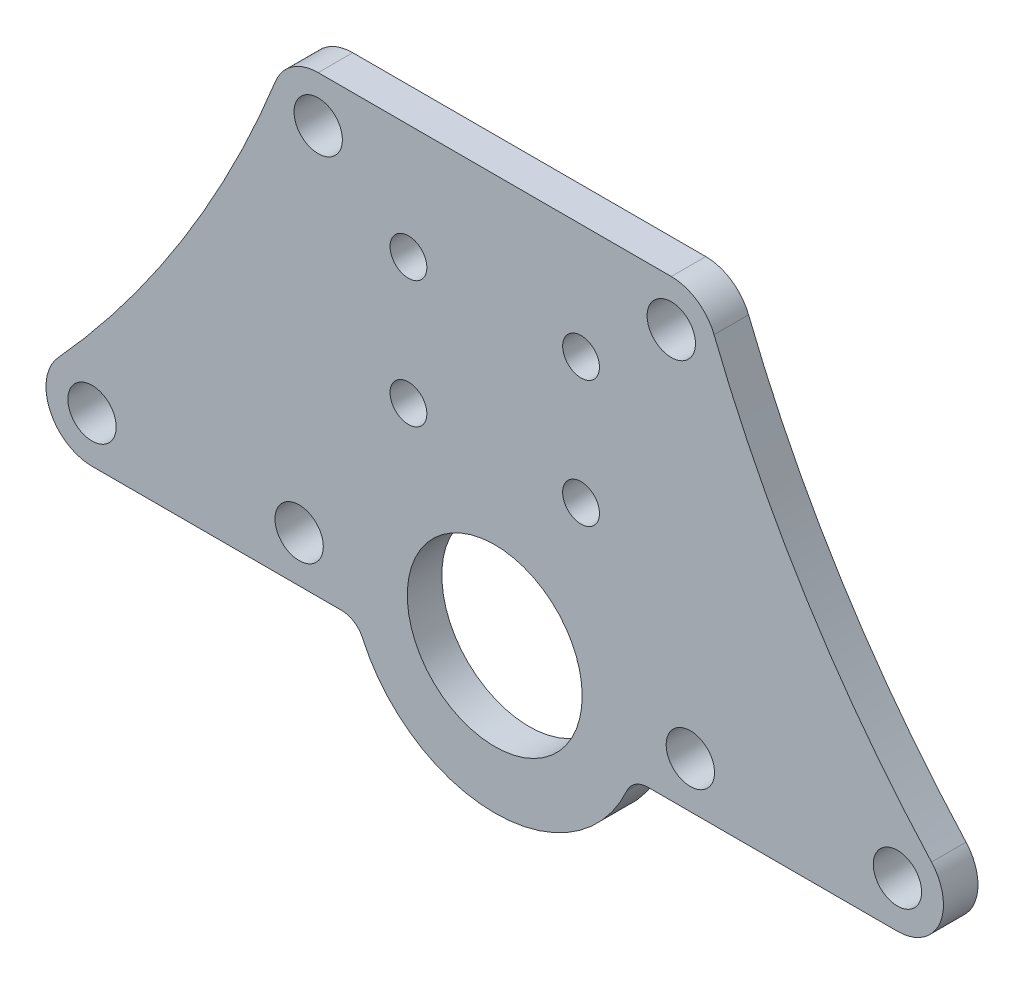
ISO-10303-21;
HEADER;
FILE_DESCRIPTION(('STEP AP214'),'2;1');
FILE_NAME('part.step','',(''),(''),'','','');
FILE_SCHEMA(('AUTOMOTIVE_DESIGN { 1 0 10303 214 1 1 1 1 }'));
ENDSEC;
DATA;
#1=APPLICATION_CONTEXT('core data for automotive mechanical design processes');
#2=APPLICATION_PROTOCOL_DEFINITION('international standard','automotive_design',2000,#1);
#3=PRODUCT_CONTEXT('',#1,'mechanical');
#4=PRODUCT('Part','Part','',(#3));
#5=PRODUCT_RELATED_PRODUCT_CATEGORY('part','',(#4));
#6=PRODUCT_DEFINITION_FORMATION('','',#4);
#7=PRODUCT_DEFINITION_CONTEXT('part definition',#1,'design');
#8=PRODUCT_DEFINITION('design','',#6,#7);
#9=PRODUCT_DEFINITION_SHAPE('','',#8);
#10=(LENGTH_UNIT() NAMED_UNIT(*) SI_UNIT(.MILLI.,.METRE.));
#11=(NAMED_UNIT(*) PLANE_ANGLE_UNIT() SI_UNIT($,.RADIAN.));
#12=(NAMED_UNIT(*) SI_UNIT($,.STERADIAN.) SOLID_ANGLE_UNIT());
#13=UNCERTAINTY_MEASURE_WITH_UNIT(LENGTH_MEASURE(1.E-05),#10,'distance_accuracy_value','');
#14=(GEOMETRIC_REPRESENTATION_CONTEXT(3) GLOBAL_UNCERTAINTY_ASSIGNED_CONTEXT((#13)) GLOBAL_UNIT_ASSIGNED_CONTEXT((#10,
#11,#12)) REPRESENTATION_CONTEXT('',''));
#15=CARTESIAN_POINT('',(0.,0.,0.));
#16=DIRECTION('',(0.,0.,1.));
#17=DIRECTION('',(1.,0.,0.));
#18=AXIS2_PLACEMENT_3D('',#15,#16,#17);
#19=CARTESIAN_POINT('',(0.,-20.,3.));
#20=DIRECTION('',(0.,0.,-1.));
#21=DIRECTION('',(-1.,0.,0.));
#22=AXIS2_PLACEMENT_3D('',#19,#20,#21);
#23=CYLINDRICAL_SURFACE('',#22,12.6);
#24=CARTESIAN_POINT('',(0.,-20.,0.));
#25=DIRECTION('',(0.,0.,1.));
#26=DIRECTION('',(1.,0.,0.));
#27=AXIS2_PLACEMENT_3D('',#24,#25,#26);
#28=CIRCLE('',#27,12.6);
#29=CARTESIAN_POINT('',(-11.4868387650895,-25.1780821917808,0.));
#30=VERTEX_POINT('',#29);
#31=CARTESIAN_POINT('',(11.4868387650895,-25.1780821917808,0.));
#32=VERTEX_POINT('',#31);
#33=EDGE_CURVE('E208',#30,#32,#28,.T.);
#34=ORIENTED_EDGE('',*,*,#33,.T.);
#35=DIRECTION('',(0.,0.,-1.));
#36=VECTOR('',#35,1.);
#37=CARTESIAN_POINT('',(11.4868387650895,-25.1780821917808,3.));
#38=LINE('',#37,#36);
#39=CARTESIAN_POINT('',(11.4868387650895,-25.1780821917808,3.));
#40=VERTEX_POINT('',#39);
#41=EDGE_CURVE('E283',#32,#40,#38,.F.);
#42=ORIENTED_EDGE('',*,*,#41,.T.);
#43=CARTESIAN_POINT('',(0.,-20.,3.));
#44=DIRECTION('',(0.,0.,1.));
#45=DIRECTION('',(1.,0.,0.));
#46=AXIS2_PLACEMENT_3D('',#43,#44,#45);
#47=CIRCLE('',#46,12.6);
#48=CARTESIAN_POINT('',(-11.4868387650895,-25.1780821917808,3.));
#49=VERTEX_POINT('',#48);
#50=EDGE_CURVE('E139',#49,#40,#47,.T.);
#51=ORIENTED_EDGE('',*,*,#50,.F.);
#52=DIRECTION('',(0.,0.,-1.));
#53=VECTOR('',#52,1.);
#54=CARTESIAN_POINT('',(-11.4868387650895,-25.1780821917808,3.));
#55=LINE('',#54,#53);
#56=EDGE_CURVE('E280',#49,#30,#55,.T.);
#57=ORIENTED_EDGE('',*,*,#56,.T.);
#58=EDGE_LOOP('',(#34,#42,#51,#57));
#59=FACE_BOUND('',#58,.T.);
#60=ADVANCED_FACE('F37',(#59),#23,.T.);
#61=CARTESIAN_POINT('',(0.,-24.,3.));
#62=DIRECTION('',(0.,1.,0.));
#63=DIRECTION('',(-1.,0.,0.));
#64=AXIS2_PLACEMENT_3D('',#61,#62,#63);
#65=PLANE('',#64);
#66=DIRECTION('',(1.,0.,0.));
#67=VECTOR('',#66,1.);
#68=CARTESIAN_POINT('',(0.,-24.,3.));
#69=LINE('',#68,#67);
#70=CARTESIAN_POINT('',(13.3101465055799,-24.,3.));
#71=VERTEX_POINT('',#70);
#72=CARTESIAN_POINT('',(35.,-24.,3.));
#73=VERTEX_POINT('',#72);
#74=EDGE_CURVE('E125',#71,#73,#69,.T.);
#75=ORIENTED_EDGE('',*,*,#74,.F.);
#76=DIRECTION('',(0.,0.,1.));
#77=VECTOR('',#76,1.);
#78=CARTESIAN_POINT('',(13.3101465055799,-24.,0.));
#79=LINE('',#78,#77);
#80=CARTESIAN_POINT('',(13.3101465055799,-24.,0.));
#81=VERTEX_POINT('',#80);
#82=EDGE_CURVE('E149',#71,#81,#79,.F.);
#83=ORIENTED_EDGE('',*,*,#82,.T.);
#84=DIRECTION('',(1.,0.,0.));
#85=VECTOR('',#84,1.);
#86=CARTESIAN_POINT('',(0.,-24.,0.));
#87=LINE('',#86,#85);
#88=CARTESIAN_POINT('',(35.,-24.,0.));
#89=VERTEX_POINT('',#88);
#90=EDGE_CURVE('E145',#81,#89,#87,.T.);
#91=ORIENTED_EDGE('',*,*,#90,.T.);
#92=DIRECTION('',(0.,0.,-1.));
#93=VECTOR('',#92,1.);
#94=CARTESIAN_POINT('',(35.,-24.,3.));
#95=LINE('',#94,#93);
#96=EDGE_CURVE('E142',#73,#89,#95,.T.);
#97=ORIENTED_EDGE('',*,*,#96,.F.);
#98=EDGE_LOOP('',(#75,#83,#91,#97));
#99=FACE_BOUND('',#98,.T.);
#100=ADVANCED_FACE('F143',(#99),#65,.F.);
#101=CARTESIAN_POINT('',(35.,-20.,3.));
#102=DIRECTION('',(0.,0.,-1.));
#103=DIRECTION('',(-1.,0.,0.));
#104=AXIS2_PLACEMENT_3D('',#101,#102,#103);
#105=CYLINDRICAL_SURFACE('',#104,4.00000000000002);
#106=CARTESIAN_POINT('',(35.,-20.,0.));
#107=DIRECTION('',(0.,0.,1.));
#108=DIRECTION('',(1.,0.,0.));
#109=AXIS2_PLACEMENT_3D('',#106,#107,#108);
#110=CIRCLE('',#109,4.00000000000002);
#111=CARTESIAN_POINT('',(37.9597935701072,-17.3093454286453,0.));
#112=VERTEX_POINT('',#111);
#113=EDGE_CURVE('E212',#89,#112,#110,.T.);
#114=ORIENTED_EDGE('',*,*,#113,.T.);
#115=DIRECTION('',(0.,0.,-1.));
#116=VECTOR('',#115,1.);
#117=CARTESIAN_POINT('',(37.9597935701072,-17.3093454286453,3.));
#118=LINE('',#117,#116);
#119=CARTESIAN_POINT('',(37.9597935701072,-17.3093454286453,3.));
#120=VERTEX_POINT('',#119);
#121=EDGE_CURVE('E150',#120,#112,#118,.T.);
#122=ORIENTED_EDGE('',*,*,#121,.F.);
#123=CARTESIAN_POINT('',(35.,-20.,3.));
#124=DIRECTION('',(0.,0.,1.));
#125=DIRECTION('',(1.,0.,0.));
#126=AXIS2_PLACEMENT_3D('',#123,#124,#125);
#127=CIRCLE('',#126,4.00000000000002);
#128=EDGE_CURVE('E131',#73,#120,#127,.T.);
#129=ORIENTED_EDGE('',*,*,#128,.F.);
#130=ORIENTED_EDGE('',*,*,#96,.T.);
#131=EDGE_LOOP('',(#114,#122,#129,#130));
#132=FACE_BOUND('',#131,.T.);
#133=ADVANCED_FACE('F152',(#132),#105,.T.);
#134=CARTESIAN_POINT('',(111.954632822788,49.9570188552223,3.));
#135=DIRECTION('',(0.,0.,-1.));
#136=DIRECTION('',(-1.,0.,0.));
#137=AXIS2_PLACEMENT_3D('',#134,#135,#136);
#138=CYLINDRICAL_SURFACE('',#137,100.);
#139=CARTESIAN_POINT('',(111.954632822788,49.9570188552223,0.));
#140=DIRECTION('',(0.,0.,1.));
#141=DIRECTION('',(1.,0.,0.));
#142=AXIS2_PLACEMENT_3D('',#139,#140,#141);
#143=CIRCLE('',#142,100.);
#144=CARTESIAN_POINT('',(19.0588225485857,12.9385311294998,0.));
#145=VERTEX_POINT('',#144);
#146=EDGE_CURVE('E214',#145,#112,#143,.T.);
#147=ORIENTED_EDGE('',*,*,#146,.F.);
#148=DIRECTION('',(0.,0.,-1.));
#149=VECTOR('',#148,1.);
#150=CARTESIAN_POINT('',(19.0588225485857,12.9385311294998,3.));
#151=LINE('',#150,#149);
#152=CARTESIAN_POINT('',(19.0588225485857,12.9385311294998,3.));
#153=VERTEX_POINT('',#152);
#154=EDGE_CURVE('E276',#153,#145,#151,.T.);
#155=ORIENTED_EDGE('',*,*,#154,.F.);
#156=CARTESIAN_POINT('',(111.954632822788,49.9570188552223,3.));
#157=DIRECTION('',(0.,0.,1.));
#158=DIRECTION('',(1.,0.,0.));
#159=AXIS2_PLACEMENT_3D('',#156,#157,#158);
#160=CIRCLE('',#159,100.);
#161=EDGE_CURVE('E154',#153,#120,#160,.T.);
#162=ORIENTED_EDGE('',*,*,#161,.T.);
#163=ORIENTED_EDGE('',*,*,#121,.T.);
#164=EDGE_LOOP('',(#147,#155,#162,#163));
#165=FACE_BOUND('',#164,.T.);
#166=ADVANCED_FACE('F312',(#165),#138,.F.);
#167=CARTESIAN_POINT('',(15.3429901376176,11.4577916204709,3.));
#168=DIRECTION('',(0.,0.,-1.));
#169=DIRECTION('',(-1.,0.,0.));
#170=AXIS2_PLACEMENT_3D('',#167,#168,#169);
#171=CYLINDRICAL_SURFACE('',#170,4.00000000000002);
#172=CARTESIAN_POINT('',(15.3429901376176,11.4577916204709,0.));
#173=DIRECTION('',(0.,0.,1.));
#174=DIRECTION('',(1.,0.,0.));
#175=AXIS2_PLACEMENT_3D('',#172,#173,#174);
#176=CIRCLE('',#175,4.00000000000002);
#177=CARTESIAN_POINT('',(15.3429901376176,15.4577916204709,0.));
#178=VERTEX_POINT('',#177);
#179=EDGE_CURVE('E217',#145,#178,#176,.T.);
#180=ORIENTED_EDGE('',*,*,#179,.T.);
#181=DIRECTION('',(0.,0.,-1.));
#182=VECTOR('',#181,1.);
#183=CARTESIAN_POINT('',(15.3429901376176,15.4577916204709,3.));
#184=LINE('',#183,#182);
#185=CARTESIAN_POINT('',(15.3429901376176,15.4577916204709,3.));
#186=VERTEX_POINT('',#185);
#187=EDGE_CURVE('E274',#186,#178,#184,.T.);
#188=ORIENTED_EDGE('',*,*,#187,.F.);
#189=CARTESIAN_POINT('',(15.3429901376176,11.4577916204709,3.));
#190=DIRECTION('',(0.,0.,1.));
#191=DIRECTION('',(1.,0.,0.));
#192=AXIS2_PLACEMENT_3D('',#189,#190,#191);
#193=CIRCLE('',#192,4.00000000000002);
#194=EDGE_CURVE('E156',#153,#186,#193,.T.);
#195=ORIENTED_EDGE('',*,*,#194,.F.);
#196=ORIENTED_EDGE('',*,*,#154,.T.);
#197=EDGE_LOOP('',(#180,#188,#195,#196));
#198=FACE_BOUND('',#197,.T.);
#199=ADVANCED_FACE('F315',(#198),#171,.T.);
#200=CARTESIAN_POINT('',(0.,15.4577916204709,3.));
#201=DIRECTION('',(0.,1.,0.));
#202=DIRECTION('',(0.,0.,1.));
#203=AXIS2_PLACEMENT_3D('',#200,#201,#202);
#204=PLANE('',#203);
#205=DIRECTION('',(1.,0.,0.));
#206=VECTOR('',#205,1.);
#207=CARTESIAN_POINT('',(0.,15.4577916204709,0.));
#208=LINE('',#207,#206);
#209=CARTESIAN_POINT('',(-15.3429901376176,15.4577916204709,0.));
#210=VERTEX_POINT('',#209);
#211=EDGE_CURVE('E220',#210,#178,#208,.T.);
#212=ORIENTED_EDGE('',*,*,#211,.F.);
#213=DIRECTION('',(0.,0.,-1.));
#214=VECTOR('',#213,1.);
#215=CARTESIAN_POINT('',(-15.3429901376176,15.4577916204709,3.));
#216=LINE('',#215,#214);
#217=CARTESIAN_POINT('',(-15.3429901376176,15.4577916204709,3.));
#218=VERTEX_POINT('',#217);
#219=EDGE_CURVE('E272',#218,#210,#216,.T.);
#220=ORIENTED_EDGE('',*,*,#219,.F.);
#221=DIRECTION('',(1.,0.,0.));
#222=VECTOR('',#221,1.);
#223=CARTESIAN_POINT('',(0.,15.4577916204709,3.));
#224=LINE('',#223,#222);
#225=EDGE_CURVE('E161',#218,#186,#224,.T.);
#226=ORIENTED_EDGE('',*,*,#225,.T.);
#227=ORIENTED_EDGE('',*,*,#187,.T.);
#228=EDGE_LOOP('',(#212,#220,#226,#227));
#229=FACE_BOUND('',#228,.T.);
#230=ADVANCED_FACE('F319',(#229),#204,.T.);
#231=CARTESIAN_POINT('',(-15.3429901376176,11.4577916204709,3.));
#232=DIRECTION('',(0.,0.,-1.));
#233=DIRECTION('',(-1.,0.,0.));
#234=AXIS2_PLACEMENT_3D('',#231,#232,#233);
#235=CYLINDRICAL_SURFACE('',#234,4.00000000000002);
#236=CARTESIAN_POINT('',(-15.3429901376176,11.4577916204709,0.));
#237=DIRECTION('',(0.,0.,1.));
#238=DIRECTION('',(1.,0.,0.));
#239=AXIS2_PLACEMENT_3D('',#236,#237,#238);
#240=CIRCLE('',#239,4.00000000000002);
#241=CARTESIAN_POINT('',(-19.0588225485857,12.9385311294998,0.));
#242=VERTEX_POINT('',#241);
#243=EDGE_CURVE('E223',#242,#210,#240,.F.);
#244=ORIENTED_EDGE('',*,*,#243,.F.);
#245=DIRECTION('',(0.,0.,-1.));
#246=VECTOR('',#245,1.);
#247=CARTESIAN_POINT('',(-19.0588225485857,12.9385311294998,3.));
#248=LINE('',#247,#246);
#249=CARTESIAN_POINT('',(-19.0588225485857,12.9385311294998,3.));
#250=VERTEX_POINT('',#249);
#251=EDGE_CURVE('E270',#250,#242,#248,.T.);
#252=ORIENTED_EDGE('',*,*,#251,.F.);
#253=CARTESIAN_POINT('',(-15.3429901376176,11.4577916204709,3.));
#254=DIRECTION('',(0.,0.,1.));
#255=DIRECTION('',(1.,0.,0.));
#256=AXIS2_PLACEMENT_3D('',#253,#254,#255);
#257=CIRCLE('',#256,4.00000000000002);
#258=EDGE_CURVE('E164',#250,#218,#257,.F.);
#259=ORIENTED_EDGE('',*,*,#258,.T.);
#260=ORIENTED_EDGE('',*,*,#219,.T.);
#261=EDGE_LOOP('',(#244,#252,#259,#260));
#262=FACE_BOUND('',#261,.T.);
#263=ADVANCED_FACE('F323',(#262),#235,.T.);
#264=CARTESIAN_POINT('',(-111.954632822788,49.9570188552223,3.));
#265=DIRECTION('',(0.,0.,-1.));
#266=DIRECTION('',(-1.,0.,0.));
#267=AXIS2_PLACEMENT_3D('',#264,#265,#266);
#268=CYLINDRICAL_SURFACE('',#267,100.);
#269=CARTESIAN_POINT('',(-111.954632822788,49.9570188552223,0.));
#270=DIRECTION('',(0.,0.,1.));
#271=DIRECTION('',(1.,0.,0.));
#272=AXIS2_PLACEMENT_3D('',#269,#270,#271);
#273=CIRCLE('',#272,100.);
#274=CARTESIAN_POINT('',(-37.9597935701072,-17.3093454286453,0.));
#275=VERTEX_POINT('',#274);
#276=EDGE_CURVE('E226',#242,#275,#273,.F.);
#277=ORIENTED_EDGE('',*,*,#276,.T.);
#278=DIRECTION('',(0.,0.,-1.));
#279=VECTOR('',#278,1.);
#280=CARTESIAN_POINT('',(-37.9597935701072,-17.3093454286453,3.));
#281=LINE('',#280,#279);
#282=CARTESIAN_POINT('',(-37.9597935701072,-17.3093454286453,3.));
#283=VERTEX_POINT('',#282);
#284=EDGE_CURVE('E268',#283,#275,#281,.T.);
#285=ORIENTED_EDGE('',*,*,#284,.F.);
#286=CARTESIAN_POINT('',(-111.954632822788,49.9570188552223,3.));
#287=DIRECTION('',(0.,0.,1.));
#288=DIRECTION('',(1.,0.,0.));
#289=AXIS2_PLACEMENT_3D('',#286,#287,#288);
#290=CIRCLE('',#289,100.);
#291=EDGE_CURVE('E167',#250,#283,#290,.F.);
#292=ORIENTED_EDGE('',*,*,#291,.F.);
#293=ORIENTED_EDGE('',*,*,#251,.T.);
#294=EDGE_LOOP('',(#277,#285,#292,#293));
#295=FACE_BOUND('',#294,.T.);
#296=ADVANCED_FACE('F327',(#295),#268,.F.);
#297=CARTESIAN_POINT('',(-35.,-20.,3.));
#298=DIRECTION('',(0.,0.,-1.));
#299=DIRECTION('',(-1.,0.,0.));
#300=AXIS2_PLACEMENT_3D('',#297,#298,#299);
#301=CYLINDRICAL_SURFACE('',#300,4.00000000000002);
#302=CARTESIAN_POINT('',(-35.,-20.,0.));
#303=DIRECTION('',(0.,0.,1.));
#304=DIRECTION('',(1.,0.,0.));
#305=AXIS2_PLACEMENT_3D('',#302,#303,#304);
#306=CIRCLE('',#305,4.00000000000002);
#307=CARTESIAN_POINT('',(-35.,-24.,0.));
#308=VERTEX_POINT('',#307);
#309=EDGE_CURVE('E229',#308,#275,#306,.F.);
#310=ORIENTED_EDGE('',*,*,#309,.F.);
#311=DIRECTION('',(0.,0.,-1.));
#312=VECTOR('',#311,1.);
#313=CARTESIAN_POINT('',(-35.,-24.,3.));
#314=LINE('',#313,#312);
#315=CARTESIAN_POINT('',(-35.,-24.,3.));
#316=VERTEX_POINT('',#315);
#317=EDGE_CURVE('E207',#316,#308,#314,.T.);
#318=ORIENTED_EDGE('',*,*,#317,.F.);
#319=CARTESIAN_POINT('',(-35.,-20.,3.));
#320=DIRECTION('',(0.,0.,1.));
#321=DIRECTION('',(1.,0.,0.));
#322=AXIS2_PLACEMENT_3D('',#319,#320,#321);
#323=CIRCLE('',#322,4.00000000000002);
#324=EDGE_CURVE('E169',#316,#283,#323,.F.);
#325=ORIENTED_EDGE('',*,*,#324,.T.);
#326=ORIENTED_EDGE('',*,*,#284,.T.);
#327=EDGE_LOOP('',(#310,#318,#325,#326));
#328=FACE_BOUND('',#327,.T.);
#329=ADVANCED_FACE('F331',(#328),#301,.T.);
#330=CARTESIAN_POINT('',(-15.3429901376176,11.4577916204709,3.));
#331=DIRECTION('',(0.,0.,-1.));
#332=DIRECTION('',(-1.,0.,0.));
#333=AXIS2_PLACEMENT_3D('',#330,#331,#332);
#334=CYLINDRICAL_SURFACE('',#333,2.1);
#335=CARTESIAN_POINT('',(-15.3429901376176,11.4577916204709,3.));
#336=DIRECTION('',(0.,0.,1.));
#337=DIRECTION('',(1.,0.,0.));
#338=AXIS2_PLACEMENT_3D('',#335,#336,#337);
#339=CIRCLE('',#338,2.1);
#340=CARTESIAN_POINT('',(-13.2429901376176,11.4577916204709,3.));
#341=VERTEX_POINT('',#340);
#342=EDGE_CURVE('E201',#341,#341,#339,.F.);
#343=ORIENTED_EDGE('',*,*,#342,.F.);
#344=EDGE_LOOP('',(#343));
#345=FACE_BOUND('',#344,.T.);
#346=CARTESIAN_POINT('',(-15.3429901376176,11.4577916204709,0.));
#347=DIRECTION('',(0.,0.,1.));
#348=DIRECTION('',(1.,0.,0.));
#349=AXIS2_PLACEMENT_3D('',#346,#347,#348);
#350=CIRCLE('',#349,2.1);
#351=CARTESIAN_POINT('',(-13.2429901376176,11.4577916204709,0.));
#352=VERTEX_POINT('',#351);
#353=EDGE_CURVE('E261',#352,#352,#350,.F.);
#354=ORIENTED_EDGE('',*,*,#353,.T.);
#355=EDGE_LOOP('',(#354));
#356=FACE_BOUND('',#355,.T.);
#357=ADVANCED_FACE('F335',(#345,#356),#334,.F.);
#358=CARTESIAN_POINT('',(15.3429901376176,11.4577916204709,3.));
#359=DIRECTION('',(0.,0.,-1.));
#360=DIRECTION('',(-1.,0.,0.));
#361=AXIS2_PLACEMENT_3D('',#358,#359,#360);
#362=CYLINDRICAL_SURFACE('',#361,2.09999999999998);
#363=CARTESIAN_POINT('',(15.3429901376176,11.4577916204709,3.));
#364=DIRECTION('',(0.,0.,1.));
#365=DIRECTION('',(1.,0.,0.));
#366=AXIS2_PLACEMENT_3D('',#363,#364,#365);
#367=CIRCLE('',#366,2.09999999999998);
#368=CARTESIAN_POINT('',(17.4429901376176,11.4577916204709,3.));
#369=VERTEX_POINT('',#368);
#370=EDGE_CURVE('E198',#369,#369,#367,.T.);
#371=ORIENTED_EDGE('',*,*,#370,.T.);
#372=EDGE_LOOP('',(#371));
#373=FACE_BOUND('',#372,.T.);
#374=CARTESIAN_POINT('',(15.3429901376176,11.4577916204709,0.));
#375=DIRECTION('',(0.,0.,1.));
#376=DIRECTION('',(1.,0.,0.));
#377=AXIS2_PLACEMENT_3D('',#374,#375,#376);
#378=CIRCLE('',#377,2.09999999999998);
#379=CARTESIAN_POINT('',(17.4429901376176,11.4577916204709,0.));
#380=VERTEX_POINT('',#379);
#381=EDGE_CURVE('E258',#380,#380,#378,.T.);
#382=ORIENTED_EDGE('',*,*,#381,.F.);
#383=EDGE_LOOP('',(#382));
#384=FACE_BOUND('',#383,.T.);
#385=ADVANCED_FACE('F372',(#373,#384),#362,.F.);
#386=CARTESIAN_POINT('',(7.5,-5.5,3.));
#387=DIRECTION('',(0.,0.,-1.));
#388=DIRECTION('',(-1.,0.,0.));
#389=AXIS2_PLACEMENT_3D('',#386,#387,#388);
#390=CYLINDRICAL_SURFACE('',#389,1.6);
#391=CARTESIAN_POINT('',(7.5,-5.5,3.));
#392=DIRECTION('',(0.,0.,1.));
#393=DIRECTION('',(1.,0.,0.));
#394=AXIS2_PLACEMENT_3D('',#391,#392,#393);
#395=CIRCLE('',#394,1.6);
#396=CARTESIAN_POINT('',(9.1,-5.5,3.));
#397=VERTEX_POINT('',#396);
#398=EDGE_CURVE('E195',#397,#397,#395,.F.);
#399=ORIENTED_EDGE('',*,*,#398,.F.);
#400=EDGE_LOOP('',(#399));
#401=FACE_BOUND('',#400,.T.);
#402=CARTESIAN_POINT('',(7.5,-5.5,0.));
#403=DIRECTION('',(0.,0.,1.));
#404=DIRECTION('',(1.,0.,0.));
#405=AXIS2_PLACEMENT_3D('',#402,#403,#404);
#406=CIRCLE('',#405,1.6);
#407=CARTESIAN_POINT('',(9.1,-5.5,0.));
#408=VERTEX_POINT('',#407);
#409=EDGE_CURVE('E255',#408,#408,#406,.F.);
#410=ORIENTED_EDGE('',*,*,#409,.T.);
#411=EDGE_LOOP('',(#410));
#412=FACE_BOUND('',#411,.T.);
#413=ADVANCED_FACE('F368',(#401,#412),#390,.F.);
#414=CARTESIAN_POINT('',(7.5,5.5,3.));
#415=DIRECTION('',(0.,0.,-1.));
#416=DIRECTION('',(-1.,0.,0.));
#417=AXIS2_PLACEMENT_3D('',#414,#415,#416);
#418=CYLINDRICAL_SURFACE('',#417,1.6);
#419=CARTESIAN_POINT('',(7.5,5.5,3.));
#420=DIRECTION('',(0.,0.,1.));
#421=DIRECTION('',(1.,0.,0.));
#422=AXIS2_PLACEMENT_3D('',#419,#420,#421);
#423=CIRCLE('',#422,1.6);
#424=CARTESIAN_POINT('',(9.1,5.5,3.));
#425=VERTEX_POINT('',#424);
#426=EDGE_CURVE('E192',#425,#425,#423,.T.);
#427=ORIENTED_EDGE('',*,*,#426,.T.);
#428=EDGE_LOOP('',(#427));
#429=FACE_BOUND('',#428,.T.);
#430=CARTESIAN_POINT('',(7.5,5.5,0.));
#431=DIRECTION('',(0.,0.,1.));
#432=DIRECTION('',(1.,0.,0.));
#433=AXIS2_PLACEMENT_3D('',#430,#431,#432);
#434=CIRCLE('',#433,1.6);
#435=CARTESIAN_POINT('',(9.1,5.5,0.));
#436=VERTEX_POINT('',#435);
#437=EDGE_CURVE('E252',#436,#436,#434,.T.);
#438=ORIENTED_EDGE('',*,*,#437,.F.);
#439=EDGE_LOOP('',(#438));
#440=FACE_BOUND('',#439,.T.);
#441=ADVANCED_FACE('F364',(#429,#440),#418,.F.);
#442=CARTESIAN_POINT('',(-7.5,5.5,3.));
#443=DIRECTION('',(0.,0.,-1.));
#444=DIRECTION('',(-1.,0.,0.));
#445=AXIS2_PLACEMENT_3D('',#442,#443,#444);
#446=CYLINDRICAL_SURFACE('',#445,1.6);
#447=CARTESIAN_POINT('',(-7.5,5.5,3.));
#448=DIRECTION('',(0.,0.,1.));
#449=DIRECTION('',(1.,0.,0.));
#450=AXIS2_PLACEMENT_3D('',#447,#448,#449);
#451=CIRCLE('',#450,1.6);
#452=CARTESIAN_POINT('',(-5.9,5.5,3.));
#453=VERTEX_POINT('',#452);
#454=EDGE_CURVE('E189',#453,#453,#451,.F.);
#455=ORIENTED_EDGE('',*,*,#454,.F.);
#456=EDGE_LOOP('',(#455));
#457=FACE_BOUND('',#456,.T.);
#458=CARTESIAN_POINT('',(-7.5,5.5,0.));
#459=DIRECTION('',(0.,0.,1.));
#460=DIRECTION('',(1.,0.,0.));
#461=AXIS2_PLACEMENT_3D('',#458,#459,#460);
#462=CIRCLE('',#461,1.6);
#463=CARTESIAN_POINT('',(-5.9,5.5,0.));
#464=VERTEX_POINT('',#463);
#465=EDGE_CURVE('E249',#464,#464,#462,.F.);
#466=ORIENTED_EDGE('',*,*,#465,.T.);
#467=EDGE_LOOP('',(#466));
#468=FACE_BOUND('',#467,.T.);
#469=ADVANCED_FACE('F360',(#457,#468),#446,.F.);
#470=CARTESIAN_POINT('',(-7.5,-5.5,3.));
#471=DIRECTION('',(0.,0.,-1.));
#472=DIRECTION('',(-1.,0.,0.));
#473=AXIS2_PLACEMENT_3D('',#470,#471,#472);
#474=CYLINDRICAL_SURFACE('',#473,1.6);
#475=CARTESIAN_POINT('',(-7.5,-5.5,3.));
#476=DIRECTION('',(0.,0.,1.));
#477=DIRECTION('',(1.,0.,0.));
#478=AXIS2_PLACEMENT_3D('',#475,#476,#477);
#479=CIRCLE('',#478,1.6);
#480=CARTESIAN_POINT('',(-5.9,-5.5,3.));
#481=VERTEX_POINT('',#480);
#482=EDGE_CURVE('E186',#481,#481,#479,.T.);
#483=ORIENTED_EDGE('',*,*,#482,.T.);
#484=EDGE_LOOP('',(#483));
#485=FACE_BOUND('',#484,.T.);
#486=CARTESIAN_POINT('',(-7.5,-5.5,0.));
#487=DIRECTION('',(0.,0.,1.));
#488=DIRECTION('',(1.,0.,0.));
#489=AXIS2_PLACEMENT_3D('',#486,#487,#488);
#490=CIRCLE('',#489,1.6);
#491=CARTESIAN_POINT('',(-5.9,-5.5,0.));
#492=VERTEX_POINT('',#491);
#493=EDGE_CURVE('E246',#492,#492,#490,.T.);
#494=ORIENTED_EDGE('',*,*,#493,.F.);
#495=EDGE_LOOP('',(#494));
#496=FACE_BOUND('',#495,.T.);
#497=ADVANCED_FACE('F356',(#485,#496),#474,.F.);
#498=CARTESIAN_POINT('',(35.,-20.,3.));
#499=DIRECTION('',(0.,0.,-1.));
#500=DIRECTION('',(-1.,0.,0.));
#501=AXIS2_PLACEMENT_3D('',#498,#499,#500);
#502=CYLINDRICAL_SURFACE('',#501,2.1);
#503=CARTESIAN_POINT('',(35.,-20.,3.));
#504=DIRECTION('',(0.,0.,1.));
#505=DIRECTION('',(1.,0.,0.));
#506=AXIS2_PLACEMENT_3D('',#503,#504,#505);
#507=CIRCLE('',#506,2.1);
#508=CARTESIAN_POINT('',(37.1,-20.,3.));
#509=VERTEX_POINT('',#508);
#510=EDGE_CURVE('E183',#509,#509,#507,.T.);
#511=ORIENTED_EDGE('',*,*,#510,.T.);
#512=EDGE_LOOP('',(#511));
#513=FACE_BOUND('',#512,.T.);
#514=CARTESIAN_POINT('',(35.,-20.,0.));
#515=DIRECTION('',(0.,0.,1.));
#516=DIRECTION('',(1.,0.,0.));
#517=AXIS2_PLACEMENT_3D('',#514,#515,#516);
#518=CIRCLE('',#517,2.1);
#519=CARTESIAN_POINT('',(37.1,-20.,0.));
#520=VERTEX_POINT('',#519);
#521=EDGE_CURVE('E243',#520,#520,#518,.T.);
#522=ORIENTED_EDGE('',*,*,#521,.F.);
#523=EDGE_LOOP('',(#522));
#524=FACE_BOUND('',#523,.T.);
#525=ADVANCED_FACE('F352',(#513,#524),#502,.F.);
#526=CARTESIAN_POINT('',(-35.,-20.,3.));
#527=DIRECTION('',(0.,0.,-1.));
#528=DIRECTION('',(-1.,0.,0.));
#529=AXIS2_PLACEMENT_3D('',#526,#527,#528);
#530=CYLINDRICAL_SURFACE('',#529,2.1);
#531=CARTESIAN_POINT('',(-35.,-20.,3.));
#532=DIRECTION('',(0.,0.,1.));
#533=DIRECTION('',(1.,0.,0.));
#534=AXIS2_PLACEMENT_3D('',#531,#532,#533);
#535=CIRCLE('',#534,2.1);
#536=CARTESIAN_POINT('',(-32.9,-20.,3.));
#537=VERTEX_POINT('',#536);
#538=EDGE_CURVE('E180',#537,#537,#535,.F.);
#539=ORIENTED_EDGE('',*,*,#538,.F.);
#540=EDGE_LOOP('',(#539));
#541=FACE_BOUND('',#540,.T.);
#542=CARTESIAN_POINT('',(-35.,-20.,0.));
#543=DIRECTION('',(0.,0.,1.));
#544=DIRECTION('',(1.,0.,0.));
#545=AXIS2_PLACEMENT_3D('',#542,#543,#544);
#546=CIRCLE('',#545,2.1);
#547=CARTESIAN_POINT('',(-32.9,-20.,0.));
#548=VERTEX_POINT('',#547);
#549=EDGE_CURVE('E240',#548,#548,#546,.F.);
#550=ORIENTED_EDGE('',*,*,#549,.T.);
#551=EDGE_LOOP('',(#550));
#552=FACE_BOUND('',#551,.T.);
#553=ADVANCED_FACE('F348',(#541,#552),#530,.F.);
#554=CARTESIAN_POINT('',(17.,-20.,3.));
#555=DIRECTION('',(0.,0.,-1.));
#556=DIRECTION('',(-1.,0.,0.));
#557=AXIS2_PLACEMENT_3D('',#554,#555,#556);
#558=CYLINDRICAL_SURFACE('',#557,2.1);
#559=CARTESIAN_POINT('',(17.,-20.,3.));
#560=DIRECTION('',(0.,0.,1.));
#561=DIRECTION('',(1.,0.,0.));
#562=AXIS2_PLACEMENT_3D('',#559,#560,#561);
#563=CIRCLE('',#562,2.1);
#564=CARTESIAN_POINT('',(19.1,-20.,3.));
#565=VERTEX_POINT('',#564);
#566=EDGE_CURVE('E177',#565,#565,#563,.T.);
#567=ORIENTED_EDGE('',*,*,#566,.T.);
#568=EDGE_LOOP('',(#567));
#569=FACE_BOUND('',#568,.T.);
#570=CARTESIAN_POINT('',(17.,-20.,0.));
#571=DIRECTION('',(0.,0.,1.));
#572=DIRECTION('',(1.,0.,0.));
#573=AXIS2_PLACEMENT_3D('',#570,#571,#572);
#574=CIRCLE('',#573,2.1);
#575=CARTESIAN_POINT('',(19.1,-20.,0.));
#576=VERTEX_POINT('',#575);
#577=EDGE_CURVE('E237',#576,#576,#574,.T.);
#578=ORIENTED_EDGE('',*,*,#577,.F.);
#579=EDGE_LOOP('',(#578));
#580=FACE_BOUND('',#579,.T.);
#581=ADVANCED_FACE('F344',(#569,#580),#558,.F.);
#582=CARTESIAN_POINT('',(0.,-20.,3.));
#583=DIRECTION('',(0.,0.,-1.));
#584=DIRECTION('',(-1.,0.,0.));
#585=AXIS2_PLACEMENT_3D('',#582,#583,#584);
#586=CYLINDRICAL_SURFACE('',#585,7.6);
#587=CARTESIAN_POINT('',(0.,-20.,3.));
#588=DIRECTION('',(0.,0.,1.));
#589=DIRECTION('',(1.,0.,0.));
#590=AXIS2_PLACEMENT_3D('',#587,#588,#589);
#591=CIRCLE('',#590,7.6);
#592=CARTESIAN_POINT('',(7.6,-20.,3.));
#593=VERTEX_POINT('',#592);
#594=EDGE_CURVE('E174',#593,#593,#591,.T.);
#595=ORIENTED_EDGE('',*,*,#594,.T.);
#596=EDGE_LOOP('',(#595));
#597=FACE_BOUND('',#596,.T.);
#598=CARTESIAN_POINT('',(0.,-20.,0.));
#599=DIRECTION('',(0.,0.,1.));
#600=DIRECTION('',(1.,0.,0.));
#601=AXIS2_PLACEMENT_3D('',#598,#599,#600);
#602=CIRCLE('',#601,7.6);
#603=CARTESIAN_POINT('',(7.6,-20.,0.));
#604=VERTEX_POINT('',#603);
#605=EDGE_CURVE('E234',#604,#604,#602,.T.);
#606=ORIENTED_EDGE('',*,*,#605,.F.);
#607=EDGE_LOOP('',(#606));
#608=FACE_BOUND('',#607,.T.);
#609=ADVANCED_FACE('F341',(#597,#608),#586,.F.);
#610=CARTESIAN_POINT('',(0.,-24.,3.));
#611=DIRECTION('',(0.,1.,0.));
#612=DIRECTION('',(-1.,0.,0.));
#613=AXIS2_PLACEMENT_3D('',#610,#611,#612);
#614=PLANE('',#613);
#615=DIRECTION('',(1.,0.,0.));
#616=VECTOR('',#615,1.);
#617=CARTESIAN_POINT('',(0.,-24.,0.));
#618=LINE('',#617,#616);
#619=CARTESIAN_POINT('',(-13.3101465055799,-24.,0.));
#620=VERTEX_POINT('',#619);
#621=EDGE_CURVE('E232',#308,#620,#618,.T.);
#622=ORIENTED_EDGE('',*,*,#621,.T.);
#623=DIRECTION('',(0.,0.,1.));
#624=VECTOR('',#623,1.);
#625=CARTESIAN_POINT('',(-13.3101465055799,-24.,3.));
#626=LINE('',#625,#624);
#627=CARTESIAN_POINT('',(-13.3101465055799,-24.,3.));
#628=VERTEX_POINT('',#627);
#629=EDGE_CURVE('E52',#620,#628,#626,.T.);
#630=ORIENTED_EDGE('',*,*,#629,.T.);
#631=DIRECTION('',(1.,0.,0.));
#632=VECTOR('',#631,1.);
#633=CARTESIAN_POINT('',(0.,-24.,3.));
#634=LINE('',#633,#632);
#635=EDGE_CURVE('E172',#316,#628,#634,.T.);
#636=ORIENTED_EDGE('',*,*,#635,.F.);
#637=ORIENTED_EDGE('',*,*,#317,.T.);
#638=EDGE_LOOP('',(#622,#630,#636,#637));
#639=FACE_BOUND('',#638,.T.);
#640=ADVANCED_FACE('F337',(#639),#614,.F.);
#641=CARTESIAN_POINT('',(-17.,-20.,3.));
#642=DIRECTION('',(0.,0.,-1.));
#643=DIRECTION('',(-1.,0.,0.));
#644=AXIS2_PLACEMENT_3D('',#641,#642,#643);
#645=CYLINDRICAL_SURFACE('',#644,2.09999999999999);
#646=CARTESIAN_POINT('',(-17.,-20.,3.));
#647=DIRECTION('',(0.,0.,1.));
#648=DIRECTION('',(1.,0.,0.));
#649=AXIS2_PLACEMENT_3D('',#646,#647,#648);
#650=CIRCLE('',#649,2.09999999999999);
#651=CARTESIAN_POINT('',(-14.9,-20.,3.));
#652=VERTEX_POINT('',#651);
#653=EDGE_CURVE('E204',#652,#652,#650,.F.);
#654=ORIENTED_EDGE('',*,*,#653,.F.);
#655=EDGE_LOOP('',(#654));
#656=FACE_BOUND('',#655,.T.);
#657=CARTESIAN_POINT('',(-17.,-20.,0.));
#658=DIRECTION('',(0.,0.,1.));
#659=DIRECTION('',(1.,0.,0.));
#660=AXIS2_PLACEMENT_3D('',#657,#658,#659);
#661=CIRCLE('',#660,2.09999999999999);
#662=CARTESIAN_POINT('',(-14.9,-20.,0.));
#663=VERTEX_POINT('',#662);
#664=EDGE_CURVE('E264',#663,#663,#661,.F.);
#665=ORIENTED_EDGE('',*,*,#664,.T.);
#666=EDGE_LOOP('',(#665));
#667=FACE_BOUND('',#666,.T.);
#668=ADVANCED_FACE('F340',(#656,#667),#645,.F.);
#669=CARTESIAN_POINT('',(0.,0.,3.));
#670=DIRECTION('',(0.,0.,1.));
#671=DIRECTION('',(1.,0.,0.));
#672=AXIS2_PLACEMENT_3D('',#669,#670,#671);
#673=PLANE('',#672);
#674=ORIENTED_EDGE('',*,*,#635,.T.);
#675=CARTESIAN_POINT('',(-13.3101465055799,-26.,3.));
#676=DIRECTION('',(0.,0.,1.));
#677=DIRECTION('',(1.,0.,0.));
#678=AXIS2_PLACEMENT_3D('',#675,#676,#677);
#679=CIRCLE('',#678,2.);
#680=EDGE_CURVE('E11',#628,#49,#679,.F.);
#681=ORIENTED_EDGE('',*,*,#680,.T.);
#682=ORIENTED_EDGE('',*,*,#50,.T.);
#683=CARTESIAN_POINT('',(13.3101465055799,-26.,3.));
#684=DIRECTION('',(0.,0.,1.));
#685=DIRECTION('',(1.,0.,0.));
#686=AXIS2_PLACEMENT_3D('',#683,#684,#685);
#687=CIRCLE('',#686,2.);
#688=EDGE_CURVE('E135',#40,#71,#687,.F.);
#689=ORIENTED_EDGE('',*,*,#688,.T.);
#690=ORIENTED_EDGE('',*,*,#74,.T.);
#691=ORIENTED_EDGE('',*,*,#128,.T.);
#692=ORIENTED_EDGE('',*,*,#161,.F.);
#693=ORIENTED_EDGE('',*,*,#194,.T.);
#694=ORIENTED_EDGE('',*,*,#225,.F.);
#695=ORIENTED_EDGE('',*,*,#258,.F.);
#696=ORIENTED_EDGE('',*,*,#291,.T.);
#697=ORIENTED_EDGE('',*,*,#324,.F.);
#698=EDGE_LOOP('',(#674,#681,#682,#689,#690,#691,#692,#693,#694,#695,#696,#697));
#699=FACE_BOUND('',#698,.T.);
#700=ORIENTED_EDGE('',*,*,#594,.F.);
#701=EDGE_LOOP('',(#700));
#702=FACE_BOUND('',#701,.T.);
#703=ORIENTED_EDGE('',*,*,#566,.F.);
#704=EDGE_LOOP('',(#703));
#705=FACE_BOUND('',#704,.T.);
#706=ORIENTED_EDGE('',*,*,#538,.T.);
#707=EDGE_LOOP('',(#706));
#708=FACE_BOUND('',#707,.T.);
#709=ORIENTED_EDGE('',*,*,#510,.F.);
#710=EDGE_LOOP('',(#709));
#711=FACE_BOUND('',#710,.T.);
#712=ORIENTED_EDGE('',*,*,#482,.F.);
#713=EDGE_LOOP('',(#712));
#714=FACE_BOUND('',#713,.T.);
#715=ORIENTED_EDGE('',*,*,#454,.T.);
#716=EDGE_LOOP('',(#715));
#717=FACE_BOUND('',#716,.T.);
#718=ORIENTED_EDGE('',*,*,#426,.F.);
#719=EDGE_LOOP('',(#718));
#720=FACE_BOUND('',#719,.T.);
#721=ORIENTED_EDGE('',*,*,#398,.T.);
#722=EDGE_LOOP('',(#721));
#723=FACE_BOUND('',#722,.T.);
#724=ORIENTED_EDGE('',*,*,#370,.F.);
#725=EDGE_LOOP('',(#724));
#726=FACE_BOUND('',#725,.T.);
#727=ORIENTED_EDGE('',*,*,#342,.T.);
#728=EDGE_LOOP('',(#727));
#729=FACE_BOUND('',#728,.T.);
#730=ORIENTED_EDGE('',*,*,#653,.T.);
#731=EDGE_LOOP('',(#730));
#732=FACE_BOUND('',#731,.T.);
#733=ADVANCED_FACE('F127',(#699,#702,#705,#708,#711,#714,#717,#720,#723,#726,#729,#732),#673,.T.);
#734=CARTESIAN_POINT('',(0.,0.,0.));
#735=DIRECTION('',(0.,0.,1.));
#736=DIRECTION('',(1.,0.,0.));
#737=AXIS2_PLACEMENT_3D('',#734,#735,#736);
#738=PLANE('',#737);
#739=ORIENTED_EDGE('',*,*,#33,.F.);
#740=CARTESIAN_POINT('',(-13.3101465055799,-26.,0.));
#741=DIRECTION('',(0.,0.,1.));
#742=DIRECTION('',(1.,0.,0.));
#743=AXIS2_PLACEMENT_3D('',#740,#741,#742);
#744=CIRCLE('',#743,2.);
#745=EDGE_CURVE('E45',#30,#620,#744,.T.);
#746=ORIENTED_EDGE('',*,*,#745,.T.);
#747=ORIENTED_EDGE('',*,*,#621,.F.);
#748=ORIENTED_EDGE('',*,*,#309,.T.);
#749=ORIENTED_EDGE('',*,*,#276,.F.);
#750=ORIENTED_EDGE('',*,*,#243,.T.);
#751=ORIENTED_EDGE('',*,*,#211,.T.);
#752=ORIENTED_EDGE('',*,*,#179,.F.);
#753=ORIENTED_EDGE('',*,*,#146,.T.);
#754=ORIENTED_EDGE('',*,*,#113,.F.);
#755=ORIENTED_EDGE('',*,*,#90,.F.);
#756=CARTESIAN_POINT('',(13.3101465055799,-26.,0.));
#757=DIRECTION('',(0.,0.,1.));
#758=DIRECTION('',(1.,0.,0.));
#759=AXIS2_PLACEMENT_3D('',#756,#757,#758);
#760=CIRCLE('',#759,2.);
#761=EDGE_CURVE('E286',#81,#32,#760,.T.);
#762=ORIENTED_EDGE('',*,*,#761,.T.);
#763=EDGE_LOOP('',(#739,#746,#747,#748,#749,#750,#751,#752,#753,#754,#755,#762));
#764=FACE_BOUND('',#763,.T.);
#765=ORIENTED_EDGE('',*,*,#605,.T.);
#766=EDGE_LOOP('',(#765));
#767=FACE_BOUND('',#766,.T.);
#768=ORIENTED_EDGE('',*,*,#577,.T.);
#769=EDGE_LOOP('',(#768));
#770=FACE_BOUND('',#769,.T.);
#771=ORIENTED_EDGE('',*,*,#549,.F.);
#772=EDGE_LOOP('',(#771));
#773=FACE_BOUND('',#772,.T.);
#774=ORIENTED_EDGE('',*,*,#521,.T.);
#775=EDGE_LOOP('',(#774));
#776=FACE_BOUND('',#775,.T.);
#777=ORIENTED_EDGE('',*,*,#493,.T.);
#778=EDGE_LOOP('',(#777));
#779=FACE_BOUND('',#778,.T.);
#780=ORIENTED_EDGE('',*,*,#465,.F.);
#781=EDGE_LOOP('',(#780));
#782=FACE_BOUND('',#781,.T.);
#783=ORIENTED_EDGE('',*,*,#437,.T.);
#784=EDGE_LOOP('',(#783));
#785=FACE_BOUND('',#784,.T.);
#786=ORIENTED_EDGE('',*,*,#409,.F.);
#787=EDGE_LOOP('',(#786));
#788=FACE_BOUND('',#787,.T.);
#789=ORIENTED_EDGE('',*,*,#381,.T.);
#790=EDGE_LOOP('',(#789));
#791=FACE_BOUND('',#790,.T.);
#792=ORIENTED_EDGE('',*,*,#353,.F.);
#793=EDGE_LOOP('',(#792));
#794=FACE_BOUND('',#793,.T.);
#795=ORIENTED_EDGE('',*,*,#664,.F.);
#796=EDGE_LOOP('',(#795));
#797=FACE_BOUND('',#796,.T.);
#798=ADVANCED_FACE('F288',(#764,#767,#770,#773,#776,#779,#782,#785,#788,#791,#794,#797),#738,.F.);
#799=CARTESIAN_POINT('',(13.3101465055799,-26.,3.));
#800=DIRECTION('',(0.,0.,-1.));
#801=DIRECTION('',(-1.,0.,0.));
#802=AXIS2_PLACEMENT_3D('',#799,#800,#801);
#803=CYLINDRICAL_SURFACE('',#802,2.);
#804=ORIENTED_EDGE('',*,*,#688,.F.);
#805=ORIENTED_EDGE('',*,*,#41,.F.);
#806=ORIENTED_EDGE('',*,*,#761,.F.);
#807=ORIENTED_EDGE('',*,*,#82,.F.);
#808=EDGE_LOOP('',(#804,#805,#806,#807));
#809=FACE_BOUND('',#808,.T.);
#810=ADVANCED_FACE('F295',(#809),#803,.F.);
#811=CARTESIAN_POINT('',(-13.3101465055799,-26.,3.));
#812=DIRECTION('',(0.,0.,-1.));
#813=DIRECTION('',(-1.,0.,0.));
#814=AXIS2_PLACEMENT_3D('',#811,#812,#813);
#815=CYLINDRICAL_SURFACE('',#814,2.);
#816=ORIENTED_EDGE('',*,*,#680,.F.);
#817=ORIENTED_EDGE('',*,*,#629,.F.);
#818=ORIENTED_EDGE('',*,*,#745,.F.);
#819=ORIENTED_EDGE('',*,*,#56,.F.);
#820=EDGE_LOOP('',(#816,#817,#818,#819));
#821=FACE_BOUND('',#820,.T.);
#822=ADVANCED_FACE('F39',(#821),#815,.F.);
#823=CLOSED_SHELL('',(#60,#100,#133,#166,#199,#230,#263,#296,#329,#357,#385,#413,#441,#469,#497,
#525,#553,#581,#609,#640,#668,#733,#798,#810,#822));
#824=MANIFOLD_SOLID_BREP('B2',#823);
#825=ADVANCED_BREP_SHAPE_REPRESENTATION('',(#18,#824),#14);
#826=SHAPE_DEFINITION_REPRESENTATION(#9,#825);
ENDSEC;
END-ISO-10303-21;
